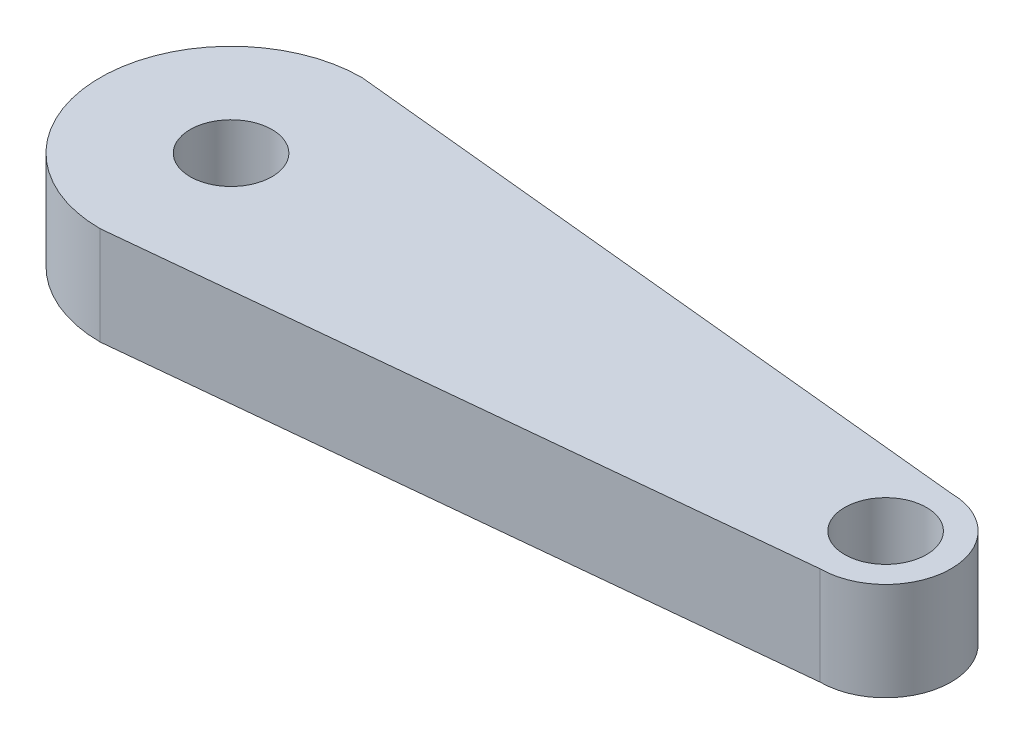
ISO-10303-21;
HEADER;
FILE_DESCRIPTION(('STEP AP214'),'2;1');
FILE_NAME('part.step','',(''),(''),'','','');
FILE_SCHEMA(('AUTOMOTIVE_DESIGN { 1 0 10303 214 1 1 1 1 }'));
ENDSEC;
DATA;
#1=APPLICATION_CONTEXT('core data for automotive mechanical design processes');
#2=APPLICATION_PROTOCOL_DEFINITION('international standard','automotive_design',2000,#1);
#3=PRODUCT_CONTEXT('',#1,'mechanical');
#4=PRODUCT('Part','Part','',(#3));
#5=PRODUCT_RELATED_PRODUCT_CATEGORY('part','',(#4));
#6=PRODUCT_DEFINITION_FORMATION('','',#4);
#7=PRODUCT_DEFINITION_CONTEXT('part definition',#1,'design');
#8=PRODUCT_DEFINITION('design','',#6,#7);
#9=PRODUCT_DEFINITION_SHAPE('','',#8);
#10=(LENGTH_UNIT() NAMED_UNIT(*) SI_UNIT(.MILLI.,.METRE.));
#11=(NAMED_UNIT(*) PLANE_ANGLE_UNIT() SI_UNIT($,.RADIAN.));
#12=(NAMED_UNIT(*) SI_UNIT($,.STERADIAN.) SOLID_ANGLE_UNIT());
#13=UNCERTAINTY_MEASURE_WITH_UNIT(LENGTH_MEASURE(1.E-05),#10,'distance_accuracy_value','');
#14=(GEOMETRIC_REPRESENTATION_CONTEXT(3) GLOBAL_UNCERTAINTY_ASSIGNED_CONTEXT((#13)) GLOBAL_UNIT_ASSIGNED_CONTEXT((#10,
#11,#12)) REPRESENTATION_CONTEXT('',''));
#15=CARTESIAN_POINT('',(0.,0.,0.));
#16=DIRECTION('',(0.,0.,1.));
#17=DIRECTION('',(1.,0.,0.));
#18=AXIS2_PLACEMENT_3D('',#15,#16,#17);
#19=CARTESIAN_POINT('',(0.,60.,0.));
#20=DIRECTION('',(0.,-1.,0.));
#21=DIRECTION('',(0.,0.,-1.));
#22=AXIS2_PLACEMENT_3D('',#19,#20,#21);
#23=CYLINDRICAL_SURFACE('',#22,80.);
#24=CARTESIAN_POINT('',(0.,0.,0.));
#25=DIRECTION('',(0.,1.,0.));
#26=DIRECTION('',(0.,0.,1.));
#27=AXIS2_PLACEMENT_3D('',#24,#25,#26);
#28=CIRCLE('',#27,80.);
#29=CARTESIAN_POINT('',(0.,0.,-80.));
#30=VERTEX_POINT('',#29);
#31=CARTESIAN_POINT('',(0.,0.,80.));
#32=VERTEX_POINT('',#31);
#33=EDGE_CURVE('E96',#30,#32,#28,.T.);
#34=ORIENTED_EDGE('',*,*,#33,.T.);
#35=DIRECTION('',(0.,-1.,0.));
#36=VECTOR('',#35,1.);
#37=CARTESIAN_POINT('',(0.,60.,80.));
#38=LINE('',#37,#36);
#39=CARTESIAN_POINT('',(0.,60.,80.));
#40=VERTEX_POINT('',#39);
#41=EDGE_CURVE('E11',#40,#32,#38,.T.);
#42=ORIENTED_EDGE('',*,*,#41,.F.);
#43=CARTESIAN_POINT('',(0.,60.,0.));
#44=DIRECTION('',(0.,1.,0.));
#45=DIRECTION('',(0.,0.,1.));
#46=AXIS2_PLACEMENT_3D('',#43,#44,#45);
#47=CIRCLE('',#46,80.);
#48=CARTESIAN_POINT('',(0.,60.,-80.));
#49=VERTEX_POINT('',#48);
#50=EDGE_CURVE('E84',#49,#40,#47,.T.);
#51=ORIENTED_EDGE('',*,*,#50,.F.);
#52=DIRECTION('',(0.,-1.,0.));
#53=VECTOR('',#52,1.);
#54=CARTESIAN_POINT('',(0.,60.,-80.));
#55=LINE('',#54,#53);
#56=EDGE_CURVE('E92',#49,#30,#55,.T.);
#57=ORIENTED_EDGE('',*,*,#56,.T.);
#58=EDGE_LOOP('',(#34,#42,#51,#57));
#59=FACE_BOUND('',#58,.T.);
#60=ADVANCED_FACE('F33',(#59),#23,.T.);
#61=CARTESIAN_POINT('',(0.,60.,80.));
#62=DIRECTION('',(-0.0995037190209989,0.,-0.995037190209989));
#63=DIRECTION('',(-0.995037190209989,0.,0.099503719020999));
#64=AXIS2_PLACEMENT_3D('',#61,#62,#63);
#65=PLANE('',#64);
#66=DIRECTION('',(0.995037190209989,0.,-0.0995037190209989));
#67=VECTOR('',#66,1.);
#68=CARTESIAN_POINT('',(0.,0.,80.));
#69=LINE('',#68,#67);
#70=CARTESIAN_POINT('',(400.,0.,40.));
#71=VERTEX_POINT('',#70);
#72=EDGE_CURVE('E88',#32,#71,#69,.T.);
#73=ORIENTED_EDGE('',*,*,#72,.T.);
#74=DIRECTION('',(0.,-1.,0.));
#75=VECTOR('',#74,1.);
#76=CARTESIAN_POINT('',(400.,60.,40.));
#77=LINE('',#76,#75);
#78=CARTESIAN_POINT('',(400.,60.,40.));
#79=VERTEX_POINT('',#78);
#80=EDGE_CURVE('E41',#79,#71,#77,.T.);
#81=ORIENTED_EDGE('',*,*,#80,.F.);
#82=DIRECTION('',(0.995037190209989,0.,-0.0995037190209989));
#83=VECTOR('',#82,1.);
#84=CARTESIAN_POINT('',(0.,60.,80.));
#85=LINE('',#84,#83);
#86=EDGE_CURVE('E79',#40,#79,#85,.T.);
#87=ORIENTED_EDGE('',*,*,#86,.F.);
#88=ORIENTED_EDGE('',*,*,#41,.T.);
#89=EDGE_LOOP('',(#73,#81,#87,#88));
#90=FACE_BOUND('',#89,.T.);
#91=ADVANCED_FACE('F87',(#90),#65,.F.);
#92=CARTESIAN_POINT('',(400.,60.,0.));
#93=DIRECTION('',(0.,-1.,0.));
#94=DIRECTION('',(0.,0.,-1.));
#95=AXIS2_PLACEMENT_3D('',#92,#93,#94);
#96=CYLINDRICAL_SURFACE('',#95,40.);
#97=CARTESIAN_POINT('',(400.,0.,0.));
#98=DIRECTION('',(0.,1.,0.));
#99=DIRECTION('',(0.,0.,1.));
#100=AXIS2_PLACEMENT_3D('',#97,#98,#99);
#101=CIRCLE('',#100,40.);
#102=CARTESIAN_POINT('',(400.,0.,-40.));
#103=VERTEX_POINT('',#102);
#104=EDGE_CURVE('E66',#71,#103,#101,.T.);
#105=ORIENTED_EDGE('',*,*,#104,.T.);
#106=DIRECTION('',(0.,-1.,0.));
#107=VECTOR('',#106,1.);
#108=CARTESIAN_POINT('',(400.,60.,-40.));
#109=LINE('',#108,#107);
#110=CARTESIAN_POINT('',(400.,60.,-40.));
#111=VERTEX_POINT('',#110);
#112=EDGE_CURVE('E89',#111,#103,#109,.T.);
#113=ORIENTED_EDGE('',*,*,#112,.F.);
#114=CARTESIAN_POINT('',(400.,60.,0.));
#115=DIRECTION('',(0.,1.,0.));
#116=DIRECTION('',(0.,0.,1.));
#117=AXIS2_PLACEMENT_3D('',#114,#115,#116);
#118=CIRCLE('',#117,40.);
#119=EDGE_CURVE('E82',#79,#111,#118,.T.);
#120=ORIENTED_EDGE('',*,*,#119,.F.);
#121=ORIENTED_EDGE('',*,*,#80,.T.);
#122=EDGE_LOOP('',(#105,#113,#120,#121));
#123=FACE_BOUND('',#122,.T.);
#124=ADVANCED_FACE('F90',(#123),#96,.T.);
#125=CARTESIAN_POINT('',(0.,60.,-80.));
#126=DIRECTION('',(-0.0995037190209989,0.,0.995037190209989));
#127=DIRECTION('',(0.995037190209989,0.,0.099503719020999));
#128=AXIS2_PLACEMENT_3D('',#125,#126,#127);
#129=PLANE('',#128);
#130=DIRECTION('',(-0.995037190209989,0.,-0.0995037190209989));
#131=VECTOR('',#130,1.);
#132=CARTESIAN_POINT('',(0.,0.,-80.));
#133=LINE('',#132,#131);
#134=EDGE_CURVE('E72',#103,#30,#133,.T.);
#135=ORIENTED_EDGE('',*,*,#134,.T.);
#136=ORIENTED_EDGE('',*,*,#56,.F.);
#137=DIRECTION('',(-0.995037190209989,0.,-0.0995037190209989));
#138=VECTOR('',#137,1.);
#139=CARTESIAN_POINT('',(0.,60.,-80.));
#140=LINE('',#139,#138);
#141=EDGE_CURVE('E49',#111,#49,#140,.T.);
#142=ORIENTED_EDGE('',*,*,#141,.F.);
#143=ORIENTED_EDGE('',*,*,#112,.T.);
#144=EDGE_LOOP('',(#135,#136,#142,#143));
#145=FACE_BOUND('',#144,.T.);
#146=ADVANCED_FACE('F104',(#145),#129,.F.);
#147=CARTESIAN_POINT('',(0.,60.,0.));
#148=DIRECTION('',(0.,1.,0.));
#149=DIRECTION('',(0.,0.,1.));
#150=AXIS2_PLACEMENT_3D('',#147,#148,#149);
#151=PLANE('',#150);
#152=CARTESIAN_POINT('',(400.,60.,0.));
#153=DIRECTION('',(0.,1.,0.));
#154=DIRECTION('',(0.,0.,1.));
#155=AXIS2_PLACEMENT_3D('',#152,#153,#154);
#156=CIRCLE('',#155,25.);
#157=CARTESIAN_POINT('',(400.,60.,25.));
#158=VERTEX_POINT('',#157);
#159=EDGE_CURVE('E116',#158,#158,#156,.T.);
#160=ORIENTED_EDGE('',*,*,#159,.F.);
#161=EDGE_LOOP('',(#160));
#162=FACE_BOUND('',#161,.T.);
#163=CARTESIAN_POINT('',(0.,60.,0.));
#164=DIRECTION('',(0.,1.,0.));
#165=DIRECTION('',(0.,0.,1.));
#166=AXIS2_PLACEMENT_3D('',#163,#164,#165);
#167=CIRCLE('',#166,25.);
#168=CARTESIAN_POINT('',(0.,60.,25.));
#169=VERTEX_POINT('',#168);
#170=EDGE_CURVE('E110',#169,#169,#167,.T.);
#171=ORIENTED_EDGE('',*,*,#170,.F.);
#172=EDGE_LOOP('',(#171));
#173=FACE_BOUND('',#172,.T.);
#174=ORIENTED_EDGE('',*,*,#50,.T.);
#175=ORIENTED_EDGE('',*,*,#86,.T.);
#176=ORIENTED_EDGE('',*,*,#119,.T.);
#177=ORIENTED_EDGE('',*,*,#141,.T.);
#178=EDGE_LOOP('',(#174,#175,#176,#177));
#179=FACE_BOUND('',#178,.T.);
#180=ADVANCED_FACE('F80',(#162,#173,#179),#151,.T.);
#181=CARTESIAN_POINT('',(0.,0.,0.));
#182=DIRECTION('',(0.,1.,0.));
#183=DIRECTION('',(0.,0.,1.));
#184=AXIS2_PLACEMENT_3D('',#181,#182,#183);
#185=PLANE('',#184);
#186=ORIENTED_EDGE('',*,*,#33,.F.);
#187=ORIENTED_EDGE('',*,*,#134,.F.);
#188=ORIENTED_EDGE('',*,*,#104,.F.);
#189=ORIENTED_EDGE('',*,*,#72,.F.);
#190=EDGE_LOOP('',(#186,#187,#188,#189));
#191=FACE_BOUND('',#190,.T.);
#192=ADVANCED_FACE('F107',(#191),#185,.F.);
#193=CARTESIAN_POINT('',(0.,9.99999999999999,0.));
#194=DIRECTION('',(0.,1.,0.));
#195=DIRECTION('',(0.,0.,1.));
#196=AXIS2_PLACEMENT_3D('',#193,#194,#195);
#197=CYLINDRICAL_SURFACE('',#196,25.);
#198=CARTESIAN_POINT('',(0.,9.99999999999999,0.));
#199=DIRECTION('',(0.,1.,0.));
#200=DIRECTION('',(0.,0.,1.));
#201=AXIS2_PLACEMENT_3D('',#198,#199,#200);
#202=CIRCLE('',#201,25.);
#203=CARTESIAN_POINT('',(0.,9.99999999999999,25.));
#204=VERTEX_POINT('',#203);
#205=EDGE_CURVE('E99',#204,#204,#202,.T.);
#206=ORIENTED_EDGE('',*,*,#205,.F.);
#207=EDGE_LOOP('',(#206));
#208=FACE_BOUND('',#207,.T.);
#209=ORIENTED_EDGE('',*,*,#170,.T.);
#210=EDGE_LOOP('',(#209));
#211=FACE_BOUND('',#210,.T.);
#212=ADVANCED_FACE('F136',(#208,#211),#197,.F.);
#213=CARTESIAN_POINT('',(0.,9.99999999999999,0.));
#214=DIRECTION('',(0.,1.,0.));
#215=DIRECTION('',(0.,0.,1.));
#216=AXIS2_PLACEMENT_3D('',#213,#214,#215);
#217=PLANE('',#216);
#218=ORIENTED_EDGE('',*,*,#205,.T.);
#219=EDGE_LOOP('',(#218));
#220=FACE_BOUND('',#219,.T.);
#221=ADVANCED_FACE('F127',(#220),#217,.T.);
#222=CARTESIAN_POINT('',(400.,9.99999999999999,0.));
#223=DIRECTION('',(0.,1.,0.));
#224=DIRECTION('',(0.,0.,1.));
#225=AXIS2_PLACEMENT_3D('',#222,#223,#224);
#226=CYLINDRICAL_SURFACE('',#225,25.);
#227=CARTESIAN_POINT('',(400.,9.99999999999999,0.));
#228=DIRECTION('',(0.,1.,0.));
#229=DIRECTION('',(0.,0.,1.));
#230=AXIS2_PLACEMENT_3D('',#227,#228,#229);
#231=CIRCLE('',#230,25.);
#232=CARTESIAN_POINT('',(400.,9.99999999999999,25.));
#233=VERTEX_POINT('',#232);
#234=EDGE_CURVE('E113',#233,#233,#231,.T.);
#235=ORIENTED_EDGE('',*,*,#234,.F.);
#236=EDGE_LOOP('',(#235));
#237=FACE_BOUND('',#236,.T.);
#238=ORIENTED_EDGE('',*,*,#159,.T.);
#239=EDGE_LOOP('',(#238));
#240=FACE_BOUND('',#239,.T.);
#241=ADVANCED_FACE('F124',(#237,#240),#226,.F.);
#242=CARTESIAN_POINT('',(400.,9.99999999999999,0.));
#243=DIRECTION('',(0.,1.,0.));
#244=DIRECTION('',(0.,0.,1.));
#245=AXIS2_PLACEMENT_3D('',#242,#243,#244);
#246=PLANE('',#245);
#247=ORIENTED_EDGE('',*,*,#234,.T.);
#248=EDGE_LOOP('',(#247));
#249=FACE_BOUND('',#248,.T.);
#250=ADVANCED_FACE('F122',(#249),#246,.T.);
#251=CLOSED_SHELL('',(#60,#91,#124,#146,#180,#192,#212,#221,#241,#250));
#252=MANIFOLD_SOLID_BREP('B2',#251);
#253=ADVANCED_BREP_SHAPE_REPRESENTATION('',(#18,#252),#14);
#254=SHAPE_DEFINITION_REPRESENTATION(#9,#253);
ENDSEC;
END-ISO-10303-21;
